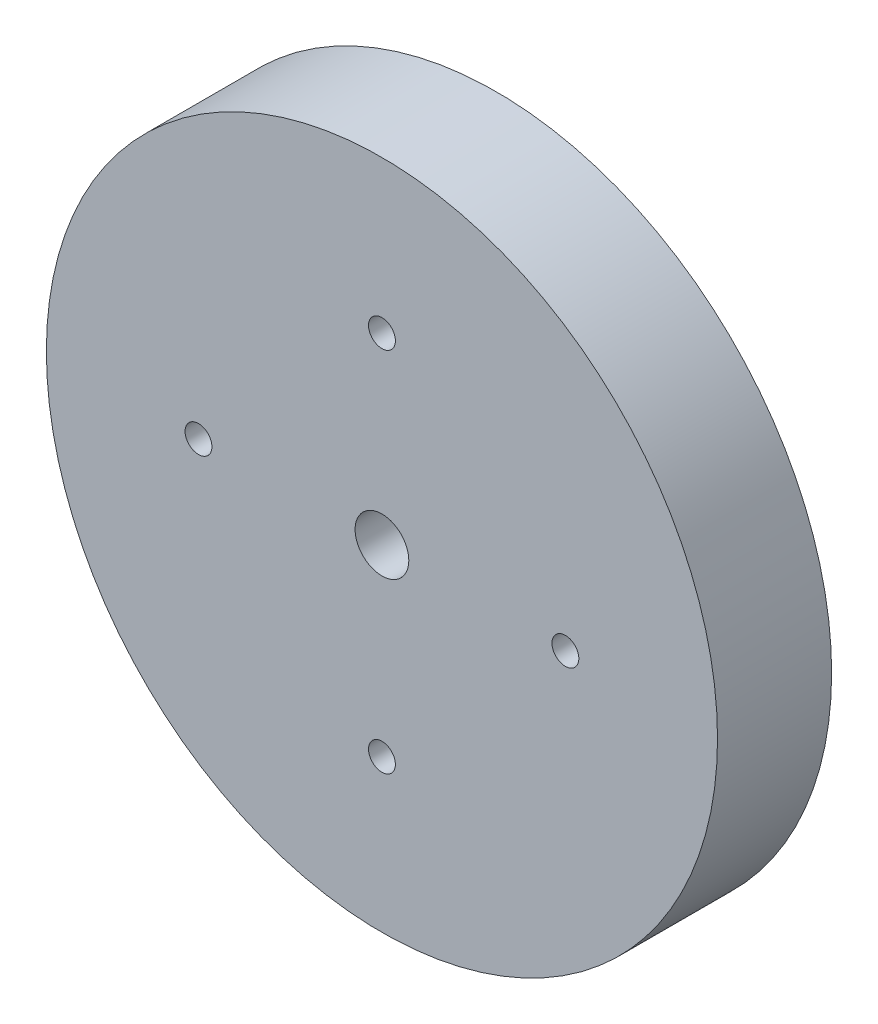
ISO-10303-21;
HEADER;
FILE_DESCRIPTION(('STEP AP214'),'2;1');
FILE_NAME('part.step','',(''),(''),'','','');
FILE_SCHEMA(('AUTOMOTIVE_DESIGN { 1 0 10303 214 1 1 1 1 }'));
ENDSEC;
DATA;
#1=APPLICATION_CONTEXT('core data for automotive mechanical design processes');
#2=APPLICATION_PROTOCOL_DEFINITION('international standard','automotive_design',2000,#1);
#3=PRODUCT_CONTEXT('',#1,'mechanical');
#4=PRODUCT('Part','Part','',(#3));
#5=PRODUCT_RELATED_PRODUCT_CATEGORY('part','',(#4));
#6=PRODUCT_DEFINITION_FORMATION('','',#4);
#7=PRODUCT_DEFINITION_CONTEXT('part definition',#1,'design');
#8=PRODUCT_DEFINITION('design','',#6,#7);
#9=PRODUCT_DEFINITION_SHAPE('','',#8);
#10=(LENGTH_UNIT() NAMED_UNIT(*) SI_UNIT(.MILLI.,.METRE.));
#11=(NAMED_UNIT(*) PLANE_ANGLE_UNIT() SI_UNIT($,.RADIAN.));
#12=(NAMED_UNIT(*) SI_UNIT($,.STERADIAN.) SOLID_ANGLE_UNIT());
#13=UNCERTAINTY_MEASURE_WITH_UNIT(LENGTH_MEASURE(1.E-05),#10,'distance_accuracy_value','');
#14=(GEOMETRIC_REPRESENTATION_CONTEXT(3) GLOBAL_UNCERTAINTY_ASSIGNED_CONTEXT((#13)) GLOBAL_UNIT_ASSIGNED_CONTEXT((#10,
#11,#12)) REPRESENTATION_CONTEXT('',''));
#15=CARTESIAN_POINT('',(0.,0.,0.));
#16=DIRECTION('',(0.,0.,1.));
#17=DIRECTION('',(1.,0.,0.));
#18=AXIS2_PLACEMENT_3D('',#15,#16,#17);
#19=CARTESIAN_POINT('',(0.,0.,6.477));
#20=DIRECTION('',(0.,0.,1.));
#21=DIRECTION('',(1.,0.,0.));
#22=AXIS2_PLACEMENT_3D('',#19,#20,#21);
#23=PLANE('',#22);
#24=CARTESIAN_POINT('',(0.,10.414,6.477));
#25=DIRECTION('',(0.,0.,1.));
#26=DIRECTION('',(1.,0.,0.));
#27=AXIS2_PLACEMENT_3D('',#24,#25,#26);
#28=CIRCLE('',#27,0.762);
#29=CARTESIAN_POINT('',(0.762,10.414,6.477));
#30=VERTEX_POINT('',#29);
#31=EDGE_CURVE('E59',#30,#30,#28,.T.);
#32=ORIENTED_EDGE('',*,*,#31,.F.);
#33=EDGE_LOOP('',(#32));
#34=FACE_BOUND('',#33,.T.);
#35=CARTESIAN_POINT('',(-10.414,0.,6.477));
#36=DIRECTION('',(0.,0.,1.));
#37=DIRECTION('',(1.,0.,0.));
#38=AXIS2_PLACEMENT_3D('',#35,#36,#37);
#39=CIRCLE('',#38,0.762000000000001);
#40=CARTESIAN_POINT('',(-9.652,0.,6.477));
#41=VERTEX_POINT('',#40);
#42=EDGE_CURVE('E47',#41,#41,#39,.T.);
#43=ORIENTED_EDGE('',*,*,#42,.F.);
#44=EDGE_LOOP('',(#43));
#45=FACE_BOUND('',#44,.T.);
#46=CARTESIAN_POINT('',(0.,0.,6.477));
#47=DIRECTION('',(0.,0.,1.));
#48=DIRECTION('',(1.,0.,0.));
#49=AXIS2_PLACEMENT_3D('',#46,#47,#48);
#50=CIRCLE('',#49,19.05);
#51=CARTESIAN_POINT('',(19.05,0.,6.477));
#52=VERTEX_POINT('',#51);
#53=EDGE_CURVE('E10',#52,#52,#50,.T.);
#54=ORIENTED_EDGE('',*,*,#53,.T.);
#55=EDGE_LOOP('',(#54));
#56=FACE_BOUND('',#55,.T.);
#57=CARTESIAN_POINT('',(0.,0.,6.477));
#58=DIRECTION('',(0.,0.,1.));
#59=DIRECTION('',(1.,0.,0.));
#60=AXIS2_PLACEMENT_3D('',#57,#58,#59);
#61=CIRCLE('',#60,1.524);
#62=CARTESIAN_POINT('',(1.524,0.,6.477));
#63=VERTEX_POINT('',#62);
#64=EDGE_CURVE('E42',#63,#63,#61,.T.);
#65=ORIENTED_EDGE('',*,*,#64,.F.);
#66=EDGE_LOOP('',(#65));
#67=FACE_BOUND('',#66,.T.);
#68=CARTESIAN_POINT('',(10.414,0.,6.477));
#69=DIRECTION('',(0.,0.,1.));
#70=DIRECTION('',(1.,0.,0.));
#71=AXIS2_PLACEMENT_3D('',#68,#69,#70);
#72=CIRCLE('',#71,0.762000000000001);
#73=CARTESIAN_POINT('',(11.176,0.,6.477));
#74=VERTEX_POINT('',#73);
#75=EDGE_CURVE('E53',#74,#74,#72,.T.);
#76=ORIENTED_EDGE('',*,*,#75,.F.);
#77=EDGE_LOOP('',(#76));
#78=FACE_BOUND('',#77,.T.);
#79=CARTESIAN_POINT('',(0.,-10.414,6.477));
#80=DIRECTION('',(0.,0.,1.));
#81=DIRECTION('',(1.,0.,0.));
#82=AXIS2_PLACEMENT_3D('',#79,#80,#81);
#83=CIRCLE('',#82,0.762);
#84=CARTESIAN_POINT('',(0.762000000000001,-10.414,6.477));
#85=VERTEX_POINT('',#84);
#86=EDGE_CURVE('E65',#85,#85,#83,.T.);
#87=ORIENTED_EDGE('',*,*,#86,.F.);
#88=EDGE_LOOP('',(#87));
#89=FACE_BOUND('',#88,.T.);
#90=ADVANCED_FACE('F31',(#34,#45,#56,#67,#78,#89),#23,.T.);
#91=CARTESIAN_POINT('',(0.,0.,0.));
#92=DIRECTION('',(0.,0.,1.));
#93=DIRECTION('',(1.,0.,0.));
#94=AXIS2_PLACEMENT_3D('',#91,#92,#93);
#95=PLANE('',#94);
#96=CARTESIAN_POINT('',(0.,0.,0.));
#97=DIRECTION('',(0.,0.,1.));
#98=DIRECTION('',(1.,0.,0.));
#99=AXIS2_PLACEMENT_3D('',#96,#97,#98);
#100=CIRCLE('',#99,19.05);
#101=CARTESIAN_POINT('',(19.05,0.,0.));
#102=VERTEX_POINT('',#101);
#103=EDGE_CURVE('E35',#102,#102,#100,.T.);
#104=ORIENTED_EDGE('',*,*,#103,.F.);
#105=EDGE_LOOP('',(#104));
#106=FACE_BOUND('',#105,.T.);
#107=CARTESIAN_POINT('',(0.,0.,0.));
#108=DIRECTION('',(0.,0.,1.));
#109=DIRECTION('',(1.,0.,0.));
#110=AXIS2_PLACEMENT_3D('',#107,#108,#109);
#111=CIRCLE('',#110,1.524);
#112=CARTESIAN_POINT('',(1.524,0.,0.));
#113=VERTEX_POINT('',#112);
#114=EDGE_CURVE('E44',#113,#113,#111,.T.);
#115=ORIENTED_EDGE('',*,*,#114,.T.);
#116=EDGE_LOOP('',(#115));
#117=FACE_BOUND('',#116,.T.);
#118=CARTESIAN_POINT('',(-10.414,0.,0.));
#119=DIRECTION('',(0.,0.,1.));
#120=DIRECTION('',(1.,0.,0.));
#121=AXIS2_PLACEMENT_3D('',#118,#119,#120);
#122=CIRCLE('',#121,0.762000000000001);
#123=CARTESIAN_POINT('',(-9.652,0.,0.));
#124=VERTEX_POINT('',#123);
#125=EDGE_CURVE('E50',#124,#124,#122,.T.);
#126=ORIENTED_EDGE('',*,*,#125,.T.);
#127=EDGE_LOOP('',(#126));
#128=FACE_BOUND('',#127,.T.);
#129=CARTESIAN_POINT('',(10.414,0.,0.));
#130=DIRECTION('',(0.,0.,1.));
#131=DIRECTION('',(1.,0.,0.));
#132=AXIS2_PLACEMENT_3D('',#129,#130,#131);
#133=CIRCLE('',#132,0.762000000000001);
#134=CARTESIAN_POINT('',(11.176,0.,0.));
#135=VERTEX_POINT('',#134);
#136=EDGE_CURVE('E56',#135,#135,#133,.T.);
#137=ORIENTED_EDGE('',*,*,#136,.T.);
#138=EDGE_LOOP('',(#137));
#139=FACE_BOUND('',#138,.T.);
#140=CARTESIAN_POINT('',(0.,10.414,0.));
#141=DIRECTION('',(0.,0.,1.));
#142=DIRECTION('',(1.,0.,0.));
#143=AXIS2_PLACEMENT_3D('',#140,#141,#142);
#144=CIRCLE('',#143,0.762);
#145=CARTESIAN_POINT('',(0.762,10.414,0.));
#146=VERTEX_POINT('',#145);
#147=EDGE_CURVE('E62',#146,#146,#144,.T.);
#148=ORIENTED_EDGE('',*,*,#147,.T.);
#149=EDGE_LOOP('',(#148));
#150=FACE_BOUND('',#149,.T.);
#151=CARTESIAN_POINT('',(0.,-10.414,0.));
#152=DIRECTION('',(0.,0.,1.));
#153=DIRECTION('',(1.,0.,0.));
#154=AXIS2_PLACEMENT_3D('',#151,#152,#153);
#155=CIRCLE('',#154,0.762);
#156=CARTESIAN_POINT('',(0.762000000000001,-10.414,0.));
#157=VERTEX_POINT('',#156);
#158=EDGE_CURVE('E68',#157,#157,#155,.T.);
#159=ORIENTED_EDGE('',*,*,#158,.T.);
#160=EDGE_LOOP('',(#159));
#161=FACE_BOUND('',#160,.T.);
#162=ADVANCED_FACE('F78',(#106,#117,#128,#139,#150,#161),#95,.F.);
#163=CARTESIAN_POINT('',(0.,0.,6.477));
#164=DIRECTION('',(0.,0.,-1.));
#165=DIRECTION('',(-1.,0.,0.));
#166=AXIS2_PLACEMENT_3D('',#163,#164,#165);
#167=CYLINDRICAL_SURFACE('',#166,19.05);
#168=ORIENTED_EDGE('',*,*,#53,.F.);
#169=EDGE_LOOP('',(#168));
#170=FACE_BOUND('',#169,.T.);
#171=ORIENTED_EDGE('',*,*,#103,.T.);
#172=EDGE_LOOP('',(#171));
#173=FACE_BOUND('',#172,.T.);
#174=ADVANCED_FACE('F33',(#170,#173),#167,.T.);
#175=CARTESIAN_POINT('',(0.,0.,6.477));
#176=DIRECTION('',(0.,0.,-1.));
#177=DIRECTION('',(-1.,0.,0.));
#178=AXIS2_PLACEMENT_3D('',#175,#176,#177);
#179=CYLINDRICAL_SURFACE('',#178,1.524);
#180=ORIENTED_EDGE('',*,*,#64,.T.);
#181=EDGE_LOOP('',(#180));
#182=FACE_BOUND('',#181,.T.);
#183=ORIENTED_EDGE('',*,*,#114,.F.);
#184=EDGE_LOOP('',(#183));
#185=FACE_BOUND('',#184,.T.);
#186=ADVANCED_FACE('F88',(#182,#185),#179,.F.);
#187=CARTESIAN_POINT('',(-10.414,0.,6.477));
#188=DIRECTION('',(0.,0.,-1.));
#189=DIRECTION('',(-1.,0.,0.));
#190=AXIS2_PLACEMENT_3D('',#187,#188,#189);
#191=CYLINDRICAL_SURFACE('',#190,0.762000000000001);
#192=ORIENTED_EDGE('',*,*,#42,.T.);
#193=EDGE_LOOP('',(#192));
#194=FACE_BOUND('',#193,.T.);
#195=ORIENTED_EDGE('',*,*,#125,.F.);
#196=EDGE_LOOP('',(#195));
#197=FACE_BOUND('',#196,.T.);
#198=ADVANCED_FACE('F91',(#194,#197),#191,.F.);
#199=CARTESIAN_POINT('',(10.414,0.,6.477));
#200=DIRECTION('',(0.,0.,-1.));
#201=DIRECTION('',(-1.,0.,0.));
#202=AXIS2_PLACEMENT_3D('',#199,#200,#201);
#203=CYLINDRICAL_SURFACE('',#202,0.762000000000001);
#204=ORIENTED_EDGE('',*,*,#75,.T.);
#205=EDGE_LOOP('',(#204));
#206=FACE_BOUND('',#205,.T.);
#207=ORIENTED_EDGE('',*,*,#136,.F.);
#208=EDGE_LOOP('',(#207));
#209=FACE_BOUND('',#208,.T.);
#210=ADVANCED_FACE('F95',(#206,#209),#203,.F.);
#211=CARTESIAN_POINT('',(0.,10.414,6.477));
#212=DIRECTION('',(0.,0.,-1.));
#213=DIRECTION('',(-1.,0.,0.));
#214=AXIS2_PLACEMENT_3D('',#211,#212,#213);
#215=CYLINDRICAL_SURFACE('',#214,0.762);
#216=ORIENTED_EDGE('',*,*,#31,.T.);
#217=EDGE_LOOP('',(#216));
#218=FACE_BOUND('',#217,.T.);
#219=ORIENTED_EDGE('',*,*,#147,.F.);
#220=EDGE_LOOP('',(#219));
#221=FACE_BOUND('',#220,.T.);
#222=ADVANCED_FACE('F99',(#218,#221),#215,.F.);
#223=CARTESIAN_POINT('',(0.,-10.414,6.477));
#224=DIRECTION('',(0.,0.,-1.));
#225=DIRECTION('',(-1.,0.,0.));
#226=AXIS2_PLACEMENT_3D('',#223,#224,#225);
#227=CYLINDRICAL_SURFACE('',#226,0.762);
#228=ORIENTED_EDGE('',*,*,#86,.T.);
#229=EDGE_LOOP('',(#228));
#230=FACE_BOUND('',#229,.T.);
#231=ORIENTED_EDGE('',*,*,#158,.F.);
#232=EDGE_LOOP('',(#231));
#233=FACE_BOUND('',#232,.T.);
#234=ADVANCED_FACE('F74',(#230,#233),#227,.F.);
#235=CLOSED_SHELL('',(#90,#162,#174,#186,#198,#210,#222,#234));
#236=MANIFOLD_SOLID_BREP('B2',#235);
#237=ADVANCED_BREP_SHAPE_REPRESENTATION('',(#18,#236),#14);
#238=SHAPE_DEFINITION_REPRESENTATION(#9,#237);
ENDSEC;
END-ISO-10303-21;
